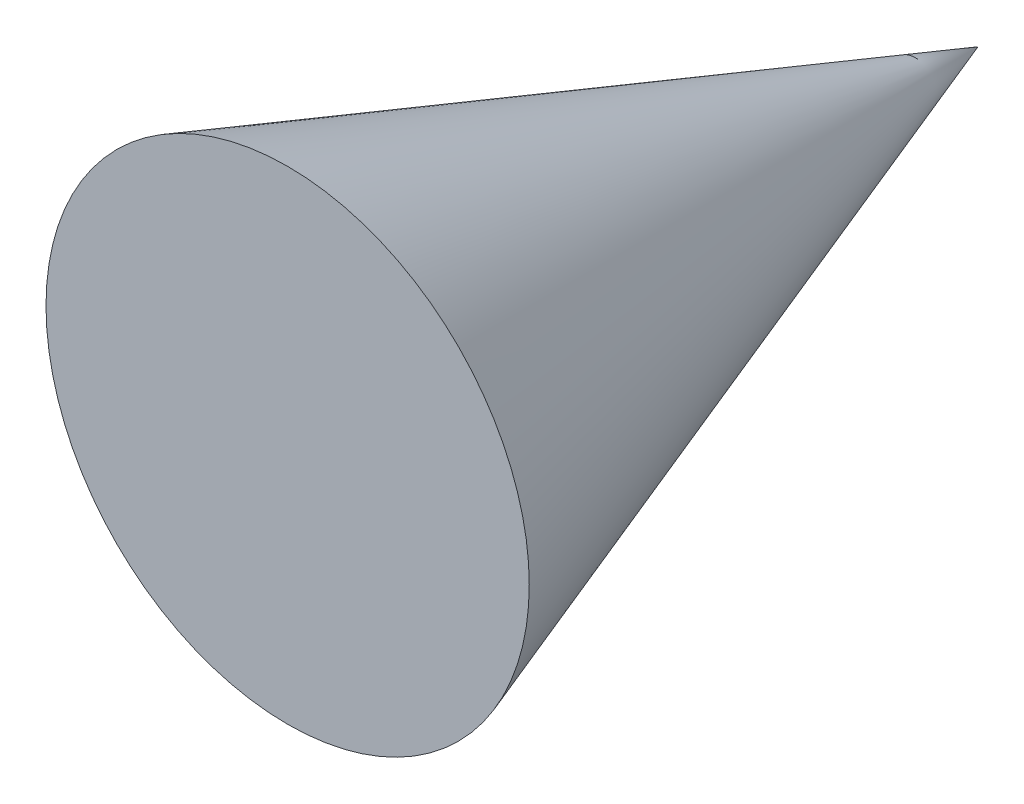
ISO-10303-21;
HEADER;
FILE_DESCRIPTION(('STEP AP214'),'2;1');
FILE_NAME('part.step','',(''),(''),'','','');
FILE_SCHEMA(('AUTOMOTIVE_DESIGN { 1 0 10303 214 1 1 1 1 }'));
ENDSEC;
DATA;
#1=APPLICATION_CONTEXT('core data for automotive mechanical design processes');
#2=APPLICATION_PROTOCOL_DEFINITION('international standard','automotive_design',2000,#1);
#3=PRODUCT_CONTEXT('',#1,'mechanical');
#4=PRODUCT('Part','Part','',(#3));
#5=PRODUCT_RELATED_PRODUCT_CATEGORY('part','',(#4));
#6=PRODUCT_DEFINITION_FORMATION('','',#4);
#7=PRODUCT_DEFINITION_CONTEXT('part definition',#1,'design');
#8=PRODUCT_DEFINITION('design','',#6,#7);
#9=PRODUCT_DEFINITION_SHAPE('','',#8);
#10=(LENGTH_UNIT() NAMED_UNIT(*) SI_UNIT(.MILLI.,.METRE.));
#11=(NAMED_UNIT(*) PLANE_ANGLE_UNIT() SI_UNIT($,.RADIAN.));
#12=(NAMED_UNIT(*) SI_UNIT($,.STERADIAN.) SOLID_ANGLE_UNIT());
#13=UNCERTAINTY_MEASURE_WITH_UNIT(LENGTH_MEASURE(1.E-05),#10,'distance_accuracy_value','');
#14=(GEOMETRIC_REPRESENTATION_CONTEXT(3) GLOBAL_UNCERTAINTY_ASSIGNED_CONTEXT((#13)) GLOBAL_UNIT_ASSIGNED_CONTEXT((#10,
#11,#12)) REPRESENTATION_CONTEXT('',''));
#15=CARTESIAN_POINT('',(0.,0.,0.));
#16=DIRECTION('',(0.,0.,1.));
#17=DIRECTION('',(1.,0.,0.));
#18=AXIS2_PLACEMENT_3D('',#15,#16,#17);
#19=CARTESIAN_POINT('',(0.,0.,20.));
#20=DIRECTION('',(0.,0.,1.));
#21=DIRECTION('',(1.,0.,0.));
#22=AXIS2_PLACEMENT_3D('',#19,#20,#21);
#23=CONICAL_SURFACE('',#22,7.,0.336674819386727);
#24=CARTESIAN_POINT('',(0.,0.,0.));
#25=VERTEX_POINT('',#24);
#26=VERTEX_LOOP('',#25);
#27=FACE_BOUND('',#26,.T.);
#28=CARTESIAN_POINT('',(0.,0.,20.));
#29=DIRECTION('',(0.,0.,-1.));
#30=DIRECTION('',(-1.,0.,0.));
#31=AXIS2_PLACEMENT_3D('',#28,#29,#30);
#32=CIRCLE('',#31,7.);
#33=CARTESIAN_POINT('',(-7.,0.,20.));
#34=VERTEX_POINT('',#33);
#35=EDGE_CURVE('E11',#34,#34,#32,.T.);
#36=ORIENTED_EDGE('',*,*,#35,.T.);
#37=EDGE_LOOP('',(#36));
#38=FACE_BOUND('',#37,.T.);
#39=ADVANCED_FACE('F37',(#27,#38),#23,.T.);
#40=CARTESIAN_POINT('',(0.,0.,20.));
#41=DIRECTION('',(0.,0.,-1.));
#42=DIRECTION('',(-1.,0.,0.));
#43=AXIS2_PLACEMENT_3D('',#40,#41,#42);
#44=PLANE('',#43);
#45=ORIENTED_EDGE('',*,*,#35,.F.);
#46=EDGE_LOOP('',(#45));
#47=FACE_BOUND('',#46,.T.);
#48=ADVANCED_FACE('F46',(#47),#44,.F.);
#49=CLOSED_SHELL('',(#39,#48));
#50=MANIFOLD_SOLID_BREP('B2',#49);
#51=ADVANCED_BREP_SHAPE_REPRESENTATION('',(#18,#50),#14);
#52=SHAPE_DEFINITION_REPRESENTATION(#9,#51);
ENDSEC;
END-ISO-10303-21;
